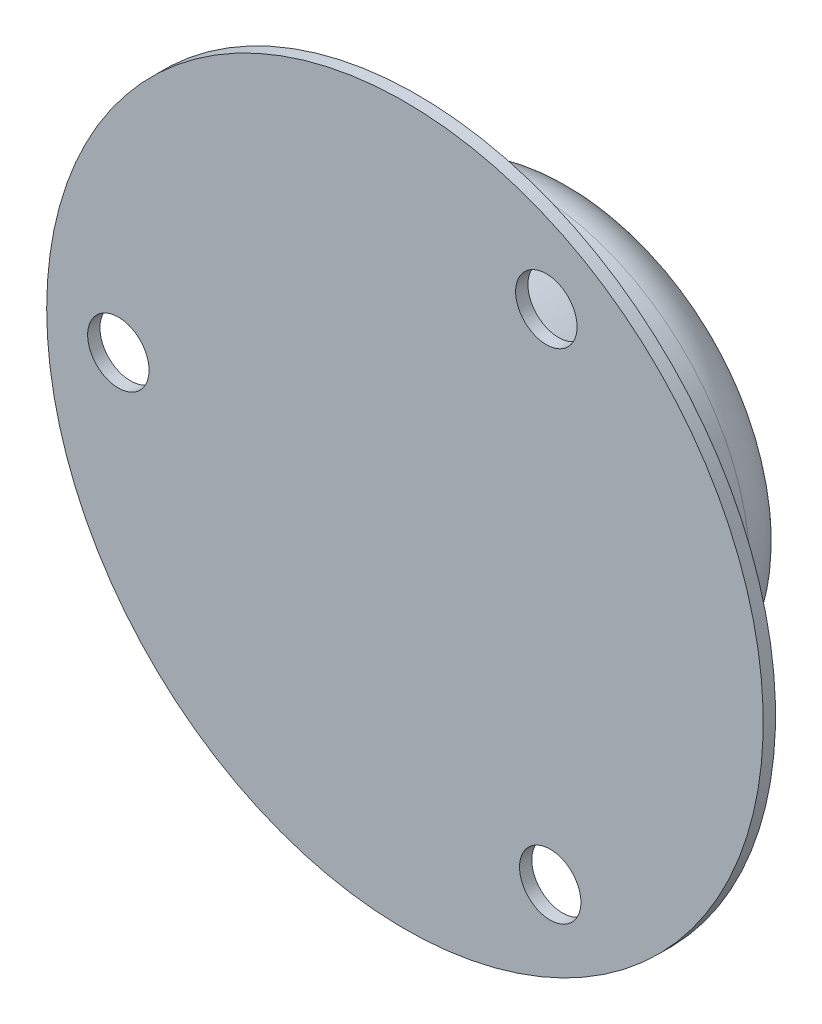
ISO-10303-21;
HEADER;
FILE_DESCRIPTION(('STEP AP214'),'2;1');
FILE_NAME('part.step','',(''),(''),'','','');
FILE_SCHEMA(('AUTOMOTIVE_DESIGN { 1 0 10303 214 1 1 1 1 }'));
ENDSEC;
DATA;
#1=APPLICATION_CONTEXT('core data for automotive mechanical design processes');
#2=APPLICATION_PROTOCOL_DEFINITION('international standard','automotive_design',2000,#1);
#3=PRODUCT_CONTEXT('',#1,'mechanical');
#4=PRODUCT('Part','Part','',(#3));
#5=PRODUCT_RELATED_PRODUCT_CATEGORY('part','',(#4));
#6=PRODUCT_DEFINITION_FORMATION('','',#4);
#7=PRODUCT_DEFINITION_CONTEXT('part definition',#1,'design');
#8=PRODUCT_DEFINITION('design','',#6,#7);
#9=PRODUCT_DEFINITION_SHAPE('','',#8);
#10=(LENGTH_UNIT() NAMED_UNIT(*) SI_UNIT(.MILLI.,.METRE.));
#11=(NAMED_UNIT(*) PLANE_ANGLE_UNIT() SI_UNIT($,.RADIAN.));
#12=(NAMED_UNIT(*) SI_UNIT($,.STERADIAN.) SOLID_ANGLE_UNIT());
#13=UNCERTAINTY_MEASURE_WITH_UNIT(LENGTH_MEASURE(1.E-05),#10,'distance_accuracy_value','');
#14=(GEOMETRIC_REPRESENTATION_CONTEXT(3) GLOBAL_UNCERTAINTY_ASSIGNED_CONTEXT((#13)) GLOBAL_UNIT_ASSIGNED_CONTEXT((#10,
#11,#12)) REPRESENTATION_CONTEXT('',''));
#15=CARTESIAN_POINT('',(0.,0.,0.));
#16=DIRECTION('',(0.,0.,1.));
#17=DIRECTION('',(1.,0.,0.));
#18=AXIS2_PLACEMENT_3D('',#15,#16,#17);
#19=CARTESIAN_POINT('',(15.3670965905298,0.,-17.2));
#20=DIRECTION('',(1.,0.,0.));
#21=DIRECTION('',(0.,1.,0.));
#22=AXIS2_PLACEMENT_3D('',#19,#20,#21);
#23=SPHERICAL_SURFACE('',#22,7.);
#24=CARTESIAN_POINT('',(15.3670965905298,0.,-17.2));
#25=DIRECTION('',(0.,0.,-1.));
#26=DIRECTION('',(1.,0.,0.));
#27=AXIS2_PLACEMENT_3D('',#24,#25,#26);
#28=CIRCLE('',#27,7.);
#29=CARTESIAN_POINT('',(8.3670965905298,0.,-17.2));
#30=VERTEX_POINT('',#29);
#31=CARTESIAN_POINT('',(22.3670965905298,0.,-17.2));
#32=VERTEX_POINT('',#31);
#33=EDGE_CURVE('E31',#30,#32,#28,.F.);
#34=ORIENTED_EDGE('',*,*,#33,.F.);
#35=CARTESIAN_POINT('',(15.3670965905298,0.,-17.2));
#36=DIRECTION('',(0.,0.,1.));
#37=DIRECTION('',(1.,0.,0.));
#38=AXIS2_PLACEMENT_3D('',#35,#36,#37);
#39=CIRCLE('',#38,7.);
#40=EDGE_CURVE('E43',#32,#30,#39,.T.);
#41=ORIENTED_EDGE('',*,*,#40,.F.);
#42=EDGE_LOOP('',(#34,#41));
#43=FACE_BOUND('',#42,.T.);
#44=ADVANCED_FACE('F27',(#43),#23,.F.);
#45=CARTESIAN_POINT('',(8.3670965905298,0.,-17.2));
#46=DIRECTION('',(0.,0.,-1.));
#47=DIRECTION('',(-1.,0.,0.));
#48=AXIS2_PLACEMENT_3D('',#45,#46,#47);
#49=PLANE('',#48);
#50=ORIENTED_EDGE('',*,*,#40,.T.);
#51=ORIENTED_EDGE('',*,*,#33,.T.);
#52=EDGE_LOOP('',(#50,#51));
#53=FACE_BOUND('',#52,.T.);
#54=CARTESIAN_POINT('',(15.3670965905298,0.,-17.2));
#55=DIRECTION('',(0.,0.,1.));
#56=DIRECTION('',(1.,0.,0.));
#57=AXIS2_PLACEMENT_3D('',#54,#55,#56);
#58=CIRCLE('',#57,8.25);
#59=CARTESIAN_POINT('',(23.6170965905298,0.,-17.2));
#60=VERTEX_POINT('',#59);
#61=EDGE_CURVE('E48',#60,#60,#58,.T.);
#62=ORIENTED_EDGE('',*,*,#61,.F.);
#63=EDGE_LOOP('',(#62));
#64=FACE_BOUND('',#63,.T.);
#65=ADVANCED_FACE('F46',(#53,#64),#49,.T.);
#66=CARTESIAN_POINT('',(15.3670965905298,0.,-14.7));
#67=DIRECTION('',(0.,0.,-1.));
#68=DIRECTION('',(-1.,0.,0.));
#69=AXIS2_PLACEMENT_3D('',#66,#67,#68);
#70=TOROIDAL_SURFACE('',#69,8.25,2.5);
#71=CARTESIAN_POINT('',(15.3670965905298,0.,-14.7));
#72=DIRECTION('',(0.,0.,-1.));
#73=DIRECTION('',(-1.,0.,0.));
#74=AXIS2_PLACEMENT_3D('',#71,#72,#73);
#75=CIRCLE('',#74,10.75);
#76=CARTESIAN_POINT('',(4.61709659052979,0.,-14.7));
#77=VERTEX_POINT('',#76);
#78=EDGE_CURVE('E50',#77,#77,#75,.F.);
#79=ORIENTED_EDGE('',*,*,#78,.F.);
#80=EDGE_LOOP('',(#79));
#81=FACE_BOUND('',#80,.T.);
#82=ORIENTED_EDGE('',*,*,#61,.T.);
#83=EDGE_LOOP('',(#82));
#84=FACE_BOUND('',#83,.T.);
#85=ADVANCED_FACE('F81',(#81,#84),#70,.T.);
#86=CARTESIAN_POINT('',(15.3670965905298,0.,-9.19999999999999));
#87=DIRECTION('',(0.,0.,-1.));
#88=DIRECTION('',(-1.,0.,0.));
#89=AXIS2_PLACEMENT_3D('',#86,#87,#88);
#90=CYLINDRICAL_SURFACE('',#89,10.75);
#91=CARTESIAN_POINT('',(15.3670965905298,0.,-9.19999999999999));
#92=DIRECTION('',(0.,0.,-1.));
#93=DIRECTION('',(-1.,0.,0.));
#94=AXIS2_PLACEMENT_3D('',#91,#92,#93);
#95=CIRCLE('',#94,10.75);
#96=CARTESIAN_POINT('',(4.61709659052979,0.,-9.19999999999999));
#97=VERTEX_POINT('',#96);
#98=EDGE_CURVE('E52',#97,#97,#95,.T.);
#99=CARTESIAN_POINT('',(4.61709659052979,0.,-9.19999999999999));
#100=CARTESIAN_POINT('',(4.61709659052979,0.,-9.25729166666666));
#101=CARTESIAN_POINT('',(4.61709659052979,0.,-9.31458333333332));
#102=CARTESIAN_POINT('',(4.61709659052979,0.,-9.42916666666666));
#103=CARTESIAN_POINT('',(4.61709659052979,0.,-9.48645833333332));
#104=CARTESIAN_POINT('',(4.61709659052979,0.,-9.60104166666666));
#105=CARTESIAN_POINT('',(4.61709659052979,0.,-9.65833333333332));
#106=CARTESIAN_POINT('',(4.61709659052979,0.,-9.77291666666666));
#107=CARTESIAN_POINT('',(4.61709659052979,0.,-9.83020833333332));
#108=CARTESIAN_POINT('',(4.61709659052979,0.,-9.94479166666666));
#109=CARTESIAN_POINT('',(4.61709659052979,0.,-10.0020833333333));
#110=CARTESIAN_POINT('',(4.61709659052979,0.,-10.1166666666667));
#111=CARTESIAN_POINT('',(4.61709659052979,0.,-10.1739583333333));
#112=CARTESIAN_POINT('',(4.61709659052979,0.,-10.2885416666667));
#113=CARTESIAN_POINT('',(4.61709659052979,0.,-10.3458333333333));
#114=CARTESIAN_POINT('',(4.61709659052979,0.,-10.4604166666667));
#115=CARTESIAN_POINT('',(4.61709659052979,0.,-10.5177083333333));
#116=CARTESIAN_POINT('',(4.61709659052979,0.,-10.6322916666667));
#117=CARTESIAN_POINT('',(4.61709659052979,0.,-10.6895833333333));
#118=CARTESIAN_POINT('',(4.61709659052979,0.,-10.8041666666667));
#119=CARTESIAN_POINT('',(4.61709659052979,0.,-10.8614583333333));
#120=CARTESIAN_POINT('',(4.61709659052979,0.,-10.9760416666667));
#121=CARTESIAN_POINT('',(4.61709659052979,0.,-11.0333333333333));
#122=CARTESIAN_POINT('',(4.61709659052979,0.,-11.1479166666667));
#123=CARTESIAN_POINT('',(4.61709659052979,0.,-11.2052083333333));
#124=CARTESIAN_POINT('',(4.61709659052979,0.,-11.3197916666667));
#125=CARTESIAN_POINT('',(4.61709659052979,0.,-11.3770833333333));
#126=CARTESIAN_POINT('',(4.61709659052979,0.,-11.4916666666667));
#127=CARTESIAN_POINT('',(4.61709659052979,0.,-11.5489583333333));
#128=CARTESIAN_POINT('',(4.61709659052979,0.,-11.6635416666667));
#129=CARTESIAN_POINT('',(4.61709659052979,0.,-11.7208333333333));
#130=CARTESIAN_POINT('',(4.61709659052979,0.,-11.8354166666667));
#131=CARTESIAN_POINT('',(4.61709659052979,0.,-11.8927083333333));
#132=CARTESIAN_POINT('',(4.61709659052979,0.,-12.0072916666667));
#133=CARTESIAN_POINT('',(4.61709659052979,0.,-12.0645833333333));
#134=CARTESIAN_POINT('',(4.61709659052979,0.,-12.1791666666667));
#135=CARTESIAN_POINT('',(4.61709659052979,0.,-12.2364583333333));
#136=CARTESIAN_POINT('',(4.61709659052979,0.,-12.3510416666667));
#137=CARTESIAN_POINT('',(4.61709659052979,0.,-12.4083333333333));
#138=CARTESIAN_POINT('',(4.61709659052979,0.,-12.5229166666667));
#139=CARTESIAN_POINT('',(4.61709659052979,0.,-12.5802083333333));
#140=CARTESIAN_POINT('',(4.61709659052979,0.,-12.6947916666667));
#141=CARTESIAN_POINT('',(4.61709659052979,0.,-12.7520833333333));
#142=CARTESIAN_POINT('',(4.61709659052979,0.,-12.8666666666667));
#143=CARTESIAN_POINT('',(4.61709659052979,0.,-12.9239583333333));
#144=CARTESIAN_POINT('',(4.61709659052979,0.,-13.0385416666667));
#145=CARTESIAN_POINT('',(4.61709659052979,0.,-13.0958333333333));
#146=CARTESIAN_POINT('',(4.61709659052979,0.,-13.2104166666667));
#147=CARTESIAN_POINT('',(4.61709659052979,0.,-13.2677083333333));
#148=CARTESIAN_POINT('',(4.61709659052979,0.,-13.3822916666667));
#149=CARTESIAN_POINT('',(4.61709659052979,0.,-13.4395833333333));
#150=CARTESIAN_POINT('',(4.61709659052979,0.,-13.5541666666667));
#151=CARTESIAN_POINT('',(4.61709659052979,0.,-13.6114583333333));
#152=CARTESIAN_POINT('',(4.61709659052979,0.,-13.7260416666667));
#153=CARTESIAN_POINT('',(4.61709659052979,0.,-13.7833333333333));
#154=CARTESIAN_POINT('',(4.61709659052979,0.,-13.8979166666667));
#155=CARTESIAN_POINT('',(4.61709659052979,0.,-13.9552083333333));
#156=CARTESIAN_POINT('',(4.61709659052979,0.,-14.0697916666667));
#157=CARTESIAN_POINT('',(4.61709659052979,0.,-14.1270833333333));
#158=CARTESIAN_POINT('',(4.61709659052979,0.,-14.2416666666667));
#159=CARTESIAN_POINT('',(4.61709659052979,0.,-14.2989583333333));
#160=CARTESIAN_POINT('',(4.61709659052979,0.,-14.4135416666667));
#161=CARTESIAN_POINT('',(4.61709659052979,0.,-14.4708333333333));
#162=CARTESIAN_POINT('',(4.61709659052979,0.,-14.5854166666667));
#163=CARTESIAN_POINT('',(4.61709659052979,0.,-14.6427083333333));
#164=CARTESIAN_POINT('',(4.61709659052979,0.,-14.7));
#165=B_SPLINE_CURVE_WITH_KNOTS('',3,(#99,#100,#101,#102,#103,#104,#105,#106,#107,#108,#109,#110,
#111,#112,#113,#114,#115,#116,#117,#118,#119,#120,#121,#122,#123,#124,#125,#126,#127,#128,#129,
#130,#131,#132,#133,#134,#135,#136,#137,#138,#139,#140,#141,#142,#143,#144,#145,#146,#147,#148,
#149,#150,#151,#152,#153,#154,#155,#156,#157,#158,#159,#160,#161,#162,#163,#164),.UNSPECIFIED.,
.F.,.F.,(4,2,2,2,2,2,2,2,2,2,2,2,2,2,2,2,2,2,2,2,2,2,2,2,2,2,2,2,2,2,2,2,4),(0.,0.171875,
0.34375,0.515625,0.687500000000001,0.859375000000001,1.03125,1.203125,1.375,1.546875,1.71875,
1.890625,2.0625,2.234375,2.40625,2.578125,2.75,2.921875,3.09375,3.265625,3.4375,3.609375,
3.78125,3.953125,4.125,4.296875,4.46875,4.640625,4.8125,4.984375,5.15625,5.328125,5.5),.UNSPECIFIED.);
#166=EDGE_CURVE('BSEAM91',#97,#77,#165,.T.);
#167=ORIENTED_EDGE('',*,*,#98,.T.);
#168=ORIENTED_EDGE('',*,*,#78,.T.);
#169=ORIENTED_EDGE('',*,*,#166,.T.);
#170=ORIENTED_EDGE('',*,*,#166,.F.);
#171=EDGE_LOOP('',(#167,#169,#168,#170));
#172=FACE_BOUND('',#171,.T.);
#173=ADVANCED_FACE('F91',(#172),#90,.T.);
#174=CARTESIAN_POINT('',(15.3670965905298,0.,-9.19999999999999));
#175=DIRECTION('',(0.,0.,1.));
#176=DIRECTION('',(1.,0.,0.));
#177=AXIS2_PLACEMENT_3D('',#174,#175,#176);
#178=PLANE('',#177);
#179=ORIENTED_EDGE('',*,*,#98,.F.);
#180=EDGE_LOOP('',(#179));
#181=FACE_BOUND('',#180,.T.);
#182=CARTESIAN_POINT('',(1.36752259540588,-0.109215177747771,-9.19999999999999));
#183=DIRECTION('',(0.,0.,1.));
#184=DIRECTION('',(1.,0.,0.));
#185=AXIS2_PLACEMENT_3D('',#182,#183,#184);
#186=CIRCLE('',#185,1.5);
#187=CARTESIAN_POINT('',(2.86752259540588,-0.109215177747771,-9.19999999999999));
#188=VERTEX_POINT('',#187);
#189=EDGE_CURVE('E64',#188,#188,#186,.T.);
#190=ORIENTED_EDGE('',*,*,#189,.T.);
#191=EDGE_LOOP('',(#190));
#192=FACE_BOUND('',#191,.T.);
#193=CARTESIAN_POINT('',(22.4614667065002,-12.0693791330634,-9.19999999999999));
#194=DIRECTION('',(0.,0.,1.));
#195=DIRECTION('',(1.,0.,0.));
#196=AXIS2_PLACEMENT_3D('',#193,#194,#195);
#197=CIRCLE('',#196,1.5);
#198=CARTESIAN_POINT('',(23.9614667065002,-12.0693791330634,-9.19999999999999));
#199=VERTEX_POINT('',#198);
#200=EDGE_CURVE('E61',#199,#199,#197,.T.);
#201=ORIENTED_EDGE('',*,*,#200,.T.);
#202=EDGE_LOOP('',(#201));
#203=FACE_BOUND('',#202,.T.);
#204=CARTESIAN_POINT('',(22.2723004696834,12.1785943108112,-9.19999999999999));
#205=DIRECTION('',(0.,0.,1.));
#206=DIRECTION('',(1.,0.,0.));
#207=AXIS2_PLACEMENT_3D('',#204,#205,#206);
#208=CIRCLE('',#207,1.5);
#209=CARTESIAN_POINT('',(23.7723004696834,12.1785943108112,-9.19999999999999));
#210=VERTEX_POINT('',#209);
#211=EDGE_CURVE('E58',#210,#210,#208,.T.);
#212=ORIENTED_EDGE('',*,*,#211,.T.);
#213=EDGE_LOOP('',(#212));
#214=FACE_BOUND('',#213,.T.);
#215=CARTESIAN_POINT('',(15.3670965905298,0.,-9.19999999999999));
#216=DIRECTION('',(0.,0.,-1.));
#217=DIRECTION('',(-1.,0.,0.));
#218=AXIS2_PLACEMENT_3D('',#215,#216,#217);
#219=CIRCLE('',#218,17.5);
#220=CARTESIAN_POINT('',(-2.13290340947021,0.,-9.19999999999999));
#221=VERTEX_POINT('',#220);
#222=EDGE_CURVE('E55',#221,#221,#219,.F.);
#223=ORIENTED_EDGE('',*,*,#222,.F.);
#224=EDGE_LOOP('',(#223));
#225=FACE_BOUND('',#224,.T.);
#226=ADVANCED_FACE('F134',(#181,#192,#203,#214,#225),#178,.F.);
#227=CARTESIAN_POINT('',(15.3670965905298,0.,-8.59999999999999));
#228=DIRECTION('',(0.,0.,-1.));
#229=DIRECTION('',(-1.,0.,0.));
#230=AXIS2_PLACEMENT_3D('',#227,#228,#229);
#231=CYLINDRICAL_SURFACE('',#230,17.5);
#232=CARTESIAN_POINT('',(15.3670965905298,0.,-8.59999999999999));
#233=DIRECTION('',(0.,0.,-1.));
#234=DIRECTION('',(-1.,0.,0.));
#235=AXIS2_PLACEMENT_3D('',#232,#233,#234);
#236=CIRCLE('',#235,17.5);
#237=CARTESIAN_POINT('',(-2.13290340947021,0.,-8.59999999999999));
#238=VERTEX_POINT('',#237);
#239=EDGE_CURVE('E67',#238,#238,#236,.F.);
#240=CARTESIAN_POINT('',(-2.13290340947021,0.,-8.59999999999999));
#241=CARTESIAN_POINT('',(-2.13290340947021,0.,-8.60624999999999));
#242=CARTESIAN_POINT('',(-2.13290340947021,0.,-8.61249999999999));
#243=CARTESIAN_POINT('',(-2.13290340947021,0.,-8.62499999999999));
#244=CARTESIAN_POINT('',(-2.13290340947021,0.,-8.63124999999999));
#245=CARTESIAN_POINT('',(-2.13290340947021,0.,-8.64374999999999));
#246=CARTESIAN_POINT('',(-2.13290340947021,0.,-8.64999999999999));
#247=CARTESIAN_POINT('',(-2.13290340947021,0.,-8.66249999999999));
#248=CARTESIAN_POINT('',(-2.13290340947021,0.,-8.66874999999999));
#249=CARTESIAN_POINT('',(-2.13290340947021,0.,-8.68124999999999));
#250=CARTESIAN_POINT('',(-2.13290340947021,0.,-8.68749999999999));
#251=CARTESIAN_POINT('',(-2.13290340947021,0.,-8.69999999999999));
#252=CARTESIAN_POINT('',(-2.13290340947021,0.,-8.70624999999999));
#253=CARTESIAN_POINT('',(-2.13290340947021,0.,-8.71874999999999));
#254=CARTESIAN_POINT('',(-2.13290340947021,0.,-8.72499999999999));
#255=CARTESIAN_POINT('',(-2.13290340947021,0.,-8.73749999999999));
#256=CARTESIAN_POINT('',(-2.13290340947021,0.,-8.74374999999999));
#257=CARTESIAN_POINT('',(-2.13290340947021,0.,-8.75624999999999));
#258=CARTESIAN_POINT('',(-2.13290340947021,0.,-8.76249999999999));
#259=CARTESIAN_POINT('',(-2.13290340947021,0.,-8.77499999999999));
#260=CARTESIAN_POINT('',(-2.13290340947021,0.,-8.78124999999999));
#261=CARTESIAN_POINT('',(-2.13290340947021,0.,-8.79374999999999));
#262=CARTESIAN_POINT('',(-2.13290340947021,0.,-8.79999999999999));
#263=CARTESIAN_POINT('',(-2.13290340947021,0.,-8.81249999999999));
#264=CARTESIAN_POINT('',(-2.13290340947021,0.,-8.81874999999999));
#265=CARTESIAN_POINT('',(-2.13290340947021,0.,-8.83124999999999));
#266=CARTESIAN_POINT('',(-2.13290340947021,0.,-8.83749999999999));
#267=CARTESIAN_POINT('',(-2.13290340947021,0.,-8.84999999999999));
#268=CARTESIAN_POINT('',(-2.13290340947021,0.,-8.85624999999999));
#269=CARTESIAN_POINT('',(-2.13290340947021,0.,-8.86874999999999));
#270=CARTESIAN_POINT('',(-2.13290340947021,0.,-8.87499999999999));
#271=CARTESIAN_POINT('',(-2.13290340947021,0.,-8.88749999999999));
#272=CARTESIAN_POINT('',(-2.13290340947021,0.,-8.89374999999999));
#273=CARTESIAN_POINT('',(-2.13290340947021,0.,-8.90624999999999));
#274=CARTESIAN_POINT('',(-2.13290340947021,0.,-8.91249999999999));
#275=CARTESIAN_POINT('',(-2.13290340947021,0.,-8.92499999999999));
#276=CARTESIAN_POINT('',(-2.13290340947021,0.,-8.93124999999999));
#277=CARTESIAN_POINT('',(-2.13290340947021,0.,-8.94374999999999));
#278=CARTESIAN_POINT('',(-2.13290340947021,0.,-8.94999999999999));
#279=CARTESIAN_POINT('',(-2.13290340947021,0.,-8.96249999999999));
#280=CARTESIAN_POINT('',(-2.13290340947021,0.,-8.96874999999999));
#281=CARTESIAN_POINT('',(-2.13290340947021,0.,-8.98124999999999));
#282=CARTESIAN_POINT('',(-2.13290340947021,0.,-8.98749999999999));
#283=CARTESIAN_POINT('',(-2.13290340947021,0.,-8.99999999999999));
#284=CARTESIAN_POINT('',(-2.13290340947021,0.,-9.00624999999999));
#285=CARTESIAN_POINT('',(-2.13290340947021,0.,-9.01874999999999));
#286=CARTESIAN_POINT('',(-2.13290340947021,0.,-9.02499999999999));
#287=CARTESIAN_POINT('',(-2.13290340947021,0.,-9.03749999999999));
#288=CARTESIAN_POINT('',(-2.13290340947021,0.,-9.04374999999999));
#289=CARTESIAN_POINT('',(-2.13290340947021,0.,-9.05624999999999));
#290=CARTESIAN_POINT('',(-2.13290340947021,0.,-9.06249999999999));
#291=CARTESIAN_POINT('',(-2.13290340947021,0.,-9.07499999999999));
#292=CARTESIAN_POINT('',(-2.13290340947021,0.,-9.08124999999999));
#293=CARTESIAN_POINT('',(-2.13290340947021,0.,-9.09374999999999));
#294=CARTESIAN_POINT('',(-2.13290340947021,0.,-9.09999999999999));
#295=CARTESIAN_POINT('',(-2.13290340947021,0.,-9.11249999999999));
#296=CARTESIAN_POINT('',(-2.13290340947021,0.,-9.11874999999999));
#297=CARTESIAN_POINT('',(-2.13290340947021,0.,-9.13124999999999));
#298=CARTESIAN_POINT('',(-2.13290340947021,0.,-9.13749999999999));
#299=CARTESIAN_POINT('',(-2.13290340947021,0.,-9.14999999999999));
#300=CARTESIAN_POINT('',(-2.13290340947021,0.,-9.15624999999999));
#301=CARTESIAN_POINT('',(-2.13290340947021,0.,-9.16874999999999));
#302=CARTESIAN_POINT('',(-2.13290340947021,0.,-9.17499999999999));
#303=CARTESIAN_POINT('',(-2.13290340947021,0.,-9.18749999999999));
#304=CARTESIAN_POINT('',(-2.13290340947021,0.,-9.19374999999999));
#305=CARTESIAN_POINT('',(-2.13290340947021,0.,-9.19999999999999));
#306=B_SPLINE_CURVE_WITH_KNOTS('',3,(#240,#241,#242,#243,#244,#245,#246,#247,#248,#249,#250,
#251,#252,#253,#254,#255,#256,#257,#258,#259,#260,#261,#262,#263,#264,#265,#266,#267,#268,#269,
#270,#271,#272,#273,#274,#275,#276,#277,#278,#279,#280,#281,#282,#283,#284,#285,#286,#287,#288,
#289,#290,#291,#292,#293,#294,#295,#296,#297,#298,#299,#300,#301,#302,#303,#304,#305),
.UNSPECIFIED.,.F.,.F.,(4,2,2,2,2,2,2,2,2,2,2,2,2,2,2,2,2,2,2,2,2,2,2,2,2,2,2,2,2,2,2,2,4),(0.,
0.0187500000000014,0.0375000000000011,0.0562500000000007,0.0750000000000004,0.0937500000000001,
0.112500000000001,0.131250000000001,0.150000000000001,0.168750000000001,0.1875,
0.206250000000002,0.225000000000001,0.243750000000001,0.262500000000001,0.28125,0.3,
0.318750000000001,0.337500000000001,0.356250000000001,0.375,0.39375,0.412500000000001,
0.431250000000001,0.450000000000001,0.46875,0.4875,0.506250000000002,0.525000000000001,
0.543750000000001,0.5625,0.58125,0.600000000000002),.UNSPECIFIED.);
#307=EDGE_CURVE('BSEAM131',#238,#221,#306,.T.);
#308=ORIENTED_EDGE('',*,*,#239,.F.);
#309=ORIENTED_EDGE('',*,*,#222,.T.);
#310=ORIENTED_EDGE('',*,*,#307,.T.);
#311=ORIENTED_EDGE('',*,*,#307,.F.);
#312=EDGE_LOOP('',(#308,#310,#309,#311));
#313=FACE_BOUND('',#312,.T.);
#314=ADVANCED_FACE('F131',(#313),#231,.T.);
#315=CARTESIAN_POINT('',(22.2723004696834,12.1785943108112,-9.19999999999999));
#316=DIRECTION('',(0.,0.,1.));
#317=DIRECTION('',(1.,0.,0.));
#318=AXIS2_PLACEMENT_3D('',#315,#316,#317);
#319=CYLINDRICAL_SURFACE('',#318,1.5);
#320=CARTESIAN_POINT('',(22.2723004696834,12.1785943108112,-8.59999999999999));
#321=DIRECTION('',(0.,0.,1.));
#322=DIRECTION('',(1.,0.,0.));
#323=AXIS2_PLACEMENT_3D('',#320,#321,#322);
#324=CIRCLE('',#323,1.5);
#325=CARTESIAN_POINT('',(23.7723004696834,12.1785943108112,-8.59999999999999));
#326=VERTEX_POINT('',#325);
#327=EDGE_CURVE('E70',#326,#326,#324,.F.);
#328=CARTESIAN_POINT('',(23.7723004696834,12.1785943108112,-8.59999999999999));
#329=CARTESIAN_POINT('',(23.7723004696834,12.1785943108112,-8.60624999999999));
#330=CARTESIAN_POINT('',(23.7723004696834,12.1785943108112,-8.61249999999999));
#331=CARTESIAN_POINT('',(23.7723004696834,12.1785943108112,-8.62499999999999));
#332=CARTESIAN_POINT('',(23.7723004696834,12.1785943108112,-8.63124999999999));
#333=CARTESIAN_POINT('',(23.7723004696834,12.1785943108112,-8.64374999999999));
#334=CARTESIAN_POINT('',(23.7723004696834,12.1785943108112,-8.65));
#335=CARTESIAN_POINT('',(23.7723004696834,12.1785943108112,-8.66249999999999));
#336=CARTESIAN_POINT('',(23.7723004696834,12.1785943108112,-8.66874999999999));
#337=CARTESIAN_POINT('',(23.7723004696834,12.1785943108112,-8.68124999999999));
#338=CARTESIAN_POINT('',(23.7723004696834,12.1785943108112,-8.68749999999999));
#339=CARTESIAN_POINT('',(23.7723004696834,12.1785943108112,-8.69999999999999));
#340=CARTESIAN_POINT('',(23.7723004696834,12.1785943108112,-8.70624999999999));
#341=CARTESIAN_POINT('',(23.7723004696834,12.1785943108112,-8.71874999999999));
#342=CARTESIAN_POINT('',(23.7723004696834,12.1785943108112,-8.72499999999999));
#343=CARTESIAN_POINT('',(23.7723004696834,12.1785943108112,-8.73749999999999));
#344=CARTESIAN_POINT('',(23.7723004696834,12.1785943108112,-8.74375));
#345=CARTESIAN_POINT('',(23.7723004696834,12.1785943108112,-8.75624999999999));
#346=CARTESIAN_POINT('',(23.7723004696834,12.1785943108112,-8.76249999999999));
#347=CARTESIAN_POINT('',(23.7723004696834,12.1785943108112,-8.77499999999999));
#348=CARTESIAN_POINT('',(23.7723004696834,12.1785943108112,-8.78124999999999));
#349=CARTESIAN_POINT('',(23.7723004696834,12.1785943108112,-8.79374999999999));
#350=CARTESIAN_POINT('',(23.7723004696834,12.1785943108112,-8.79999999999999));
#351=CARTESIAN_POINT('',(23.7723004696834,12.1785943108112,-8.81249999999999));
#352=CARTESIAN_POINT('',(23.7723004696834,12.1785943108112,-8.81874999999999));
#353=CARTESIAN_POINT('',(23.7723004696834,12.1785943108112,-8.83124999999999));
#354=CARTESIAN_POINT('',(23.7723004696834,12.1785943108112,-8.8375));
#355=CARTESIAN_POINT('',(23.7723004696834,12.1785943108112,-8.84999999999999));
#356=CARTESIAN_POINT('',(23.7723004696834,12.1785943108112,-8.85624999999999));
#357=CARTESIAN_POINT('',(23.7723004696834,12.1785943108112,-8.86874999999999));
#358=CARTESIAN_POINT('',(23.7723004696834,12.1785943108112,-8.87499999999999));
#359=CARTESIAN_POINT('',(23.7723004696834,12.1785943108112,-8.88749999999999));
#360=CARTESIAN_POINT('',(23.7723004696834,12.1785943108112,-8.89374999999999));
#361=CARTESIAN_POINT('',(23.7723004696834,12.1785943108112,-8.90624999999999));
#362=CARTESIAN_POINT('',(23.7723004696834,12.1785943108112,-8.91249999999999));
#363=CARTESIAN_POINT('',(23.7723004696834,12.1785943108112,-8.92499999999999));
#364=CARTESIAN_POINT('',(23.7723004696834,12.1785943108112,-8.93125));
#365=CARTESIAN_POINT('',(23.7723004696834,12.1785943108112,-8.94374999999999));
#366=CARTESIAN_POINT('',(23.7723004696834,12.1785943108112,-8.94999999999999));
#367=CARTESIAN_POINT('',(23.7723004696834,12.1785943108112,-8.96249999999999));
#368=CARTESIAN_POINT('',(23.7723004696834,12.1785943108112,-8.96874999999999));
#369=CARTESIAN_POINT('',(23.7723004696834,12.1785943108112,-8.98124999999999));
#370=CARTESIAN_POINT('',(23.7723004696834,12.1785943108112,-8.98749999999999));
#371=CARTESIAN_POINT('',(23.7723004696834,12.1785943108112,-8.99999999999999));
#372=CARTESIAN_POINT('',(23.7723004696834,12.1785943108112,-9.00624999999999));
#373=CARTESIAN_POINT('',(23.7723004696834,12.1785943108112,-9.01874999999999));
#374=CARTESIAN_POINT('',(23.7723004696834,12.1785943108112,-9.025));
#375=CARTESIAN_POINT('',(23.7723004696834,12.1785943108112,-9.03749999999999));
#376=CARTESIAN_POINT('',(23.7723004696834,12.1785943108112,-9.04374999999999));
#377=CARTESIAN_POINT('',(23.7723004696834,12.1785943108112,-9.05624999999999));
#378=CARTESIAN_POINT('',(23.7723004696834,12.1785943108112,-9.06249999999999));
#379=CARTESIAN_POINT('',(23.7723004696834,12.1785943108112,-9.07499999999999));
#380=CARTESIAN_POINT('',(23.7723004696834,12.1785943108112,-9.08124999999999));
#381=CARTESIAN_POINT('',(23.7723004696834,12.1785943108112,-9.09374999999999));
#382=CARTESIAN_POINT('',(23.7723004696834,12.1785943108112,-9.09999999999999));
#383=CARTESIAN_POINT('',(23.7723004696834,12.1785943108112,-9.11249999999999));
#384=CARTESIAN_POINT('',(23.7723004696834,12.1785943108112,-9.11875));
#385=CARTESIAN_POINT('',(23.7723004696834,12.1785943108112,-9.13124999999999));
#386=CARTESIAN_POINT('',(23.7723004696834,12.1785943108112,-9.13749999999999));
#387=CARTESIAN_POINT('',(23.7723004696834,12.1785943108112,-9.14999999999999));
#388=CARTESIAN_POINT('',(23.7723004696834,12.1785943108112,-9.15624999999999));
#389=CARTESIAN_POINT('',(23.7723004696834,12.1785943108112,-9.16874999999999));
#390=CARTESIAN_POINT('',(23.7723004696834,12.1785943108112,-9.17499999999999));
#391=CARTESIAN_POINT('',(23.7723004696834,12.1785943108112,-9.18749999999999));
#392=CARTESIAN_POINT('',(23.7723004696834,12.1785943108112,-9.19374999999999));
#393=CARTESIAN_POINT('',(23.7723004696834,12.1785943108112,-9.19999999999999));
#394=B_SPLINE_CURVE_WITH_KNOTS('',3,(#328,#329,#330,#331,#332,#333,#334,#335,#336,#337,#338,
#339,#340,#341,#342,#343,#344,#345,#346,#347,#348,#349,#350,#351,#352,#353,#354,#355,#356,#357,
#358,#359,#360,#361,#362,#363,#364,#365,#366,#367,#368,#369,#370,#371,#372,#373,#374,#375,#376,
#377,#378,#379,#380,#381,#382,#383,#384,#385,#386,#387,#388,#389,#390,#391,#392,#393),
.UNSPECIFIED.,.F.,.F.,(4,2,2,2,2,2,2,2,2,2,2,2,2,2,2,2,2,2,2,2,2,2,2,2,2,2,2,2,2,2,2,2,4),(0.,
0.0187500000000014,0.0375000000000011,0.0562500000000007,0.0750000000000004,0.0937500000000001,
0.112500000000001,0.131250000000001,0.150000000000001,0.168750000000001,0.1875,
0.206250000000002,0.225000000000001,0.243750000000001,0.262500000000001,0.28125,
0.300000000000002,0.318750000000001,0.337500000000001,0.356250000000001,0.375,0.39375,
0.412500000000001,0.431250000000001,0.450000000000001,0.46875,0.4875,0.506250000000002,
0.525000000000001,0.543750000000001,0.5625,0.58125,0.6),.UNSPECIFIED.);
#395=EDGE_CURVE('BSEAM127',#326,#210,#394,.T.);
#396=ORIENTED_EDGE('',*,*,#327,.F.);
#397=ORIENTED_EDGE('',*,*,#211,.F.);
#398=ORIENTED_EDGE('',*,*,#395,.T.);
#399=ORIENTED_EDGE('',*,*,#395,.F.);
#400=EDGE_LOOP('',(#396,#398,#397,#399));
#401=FACE_BOUND('',#400,.T.);
#402=ADVANCED_FACE('F127',(#401),#319,.F.);
#403=CARTESIAN_POINT('',(22.4614667065002,-12.0693791330634,-9.19999999999999));
#404=DIRECTION('',(0.,0.,1.));
#405=DIRECTION('',(1.,0.,0.));
#406=AXIS2_PLACEMENT_3D('',#403,#404,#405);
#407=CYLINDRICAL_SURFACE('',#406,1.5);
#408=CARTESIAN_POINT('',(22.4614667065002,-12.0693791330634,-8.59999999999999));
#409=DIRECTION('',(0.,0.,1.));
#410=DIRECTION('',(1.,0.,0.));
#411=AXIS2_PLACEMENT_3D('',#408,#409,#410);
#412=CIRCLE('',#411,1.5);
#413=CARTESIAN_POINT('',(23.9614667065002,-12.0693791330634,-8.59999999999999));
#414=VERTEX_POINT('',#413);
#415=EDGE_CURVE('E37',#414,#414,#412,.F.);
#416=CARTESIAN_POINT('',(23.9614667065002,-12.0693791330634,-8.59999999999999));
#417=CARTESIAN_POINT('',(23.9614667065002,-12.0693791330634,-8.60624999999999));
#418=CARTESIAN_POINT('',(23.9614667065002,-12.0693791330634,-8.61249999999999));
#419=CARTESIAN_POINT('',(23.9614667065002,-12.0693791330634,-8.62499999999999));
#420=CARTESIAN_POINT('',(23.9614667065002,-12.0693791330634,-8.63124999999999));
#421=CARTESIAN_POINT('',(23.9614667065002,-12.0693791330634,-8.64374999999999));
#422=CARTESIAN_POINT('',(23.9614667065002,-12.0693791330634,-8.65));
#423=CARTESIAN_POINT('',(23.9614667065002,-12.0693791330634,-8.66249999999999));
#424=CARTESIAN_POINT('',(23.9614667065002,-12.0693791330634,-8.66874999999999));
#425=CARTESIAN_POINT('',(23.9614667065002,-12.0693791330634,-8.68124999999999));
#426=CARTESIAN_POINT('',(23.9614667065002,-12.0693791330634,-8.68749999999999));
#427=CARTESIAN_POINT('',(23.9614667065002,-12.0693791330634,-8.69999999999999));
#428=CARTESIAN_POINT('',(23.9614667065002,-12.0693791330634,-8.70624999999999));
#429=CARTESIAN_POINT('',(23.9614667065002,-12.0693791330634,-8.71874999999999));
#430=CARTESIAN_POINT('',(23.9614667065002,-12.0693791330634,-8.72499999999999));
#431=CARTESIAN_POINT('',(23.9614667065002,-12.0693791330634,-8.73749999999999));
#432=CARTESIAN_POINT('',(23.9614667065002,-12.0693791330634,-8.74375));
#433=CARTESIAN_POINT('',(23.9614667065002,-12.0693791330634,-8.75624999999999));
#434=CARTESIAN_POINT('',(23.9614667065002,-12.0693791330634,-8.76249999999999));
#435=CARTESIAN_POINT('',(23.9614667065002,-12.0693791330634,-8.77499999999999));
#436=CARTESIAN_POINT('',(23.9614667065002,-12.0693791330634,-8.78124999999999));
#437=CARTESIAN_POINT('',(23.9614667065002,-12.0693791330634,-8.79374999999999));
#438=CARTESIAN_POINT('',(23.9614667065002,-12.0693791330634,-8.79999999999999));
#439=CARTESIAN_POINT('',(23.9614667065002,-12.0693791330634,-8.81249999999999));
#440=CARTESIAN_POINT('',(23.9614667065002,-12.0693791330634,-8.81874999999999));
#441=CARTESIAN_POINT('',(23.9614667065002,-12.0693791330634,-8.83124999999999));
#442=CARTESIAN_POINT('',(23.9614667065002,-12.0693791330634,-8.8375));
#443=CARTESIAN_POINT('',(23.9614667065002,-12.0693791330634,-8.84999999999999));
#444=CARTESIAN_POINT('',(23.9614667065002,-12.0693791330634,-8.85624999999999));
#445=CARTESIAN_POINT('',(23.9614667065002,-12.0693791330634,-8.86874999999999));
#446=CARTESIAN_POINT('',(23.9614667065002,-12.0693791330634,-8.87499999999999));
#447=CARTESIAN_POINT('',(23.9614667065002,-12.0693791330634,-8.88749999999999));
#448=CARTESIAN_POINT('',(23.9614667065002,-12.0693791330634,-8.89374999999999));
#449=CARTESIAN_POINT('',(23.9614667065002,-12.0693791330634,-8.90624999999999));
#450=CARTESIAN_POINT('',(23.9614667065002,-12.0693791330634,-8.91249999999999));
#451=CARTESIAN_POINT('',(23.9614667065002,-12.0693791330634,-8.92499999999999));
#452=CARTESIAN_POINT('',(23.9614667065002,-12.0693791330634,-8.93125));
#453=CARTESIAN_POINT('',(23.9614667065002,-12.0693791330634,-8.94374999999999));
#454=CARTESIAN_POINT('',(23.9614667065002,-12.0693791330634,-8.94999999999999));
#455=CARTESIAN_POINT('',(23.9614667065002,-12.0693791330634,-8.96249999999999));
#456=CARTESIAN_POINT('',(23.9614667065002,-12.0693791330634,-8.96874999999999));
#457=CARTESIAN_POINT('',(23.9614667065002,-12.0693791330634,-8.98124999999999));
#458=CARTESIAN_POINT('',(23.9614667065002,-12.0693791330634,-8.98749999999999));
#459=CARTESIAN_POINT('',(23.9614667065002,-12.0693791330634,-8.99999999999999));
#460=CARTESIAN_POINT('',(23.9614667065002,-12.0693791330634,-9.00624999999999));
#461=CARTESIAN_POINT('',(23.9614667065002,-12.0693791330634,-9.01874999999999));
#462=CARTESIAN_POINT('',(23.9614667065002,-12.0693791330634,-9.025));
#463=CARTESIAN_POINT('',(23.9614667065002,-12.0693791330634,-9.03749999999999));
#464=CARTESIAN_POINT('',(23.9614667065002,-12.0693791330634,-9.04374999999999));
#465=CARTESIAN_POINT('',(23.9614667065002,-12.0693791330634,-9.05624999999999));
#466=CARTESIAN_POINT('',(23.9614667065002,-12.0693791330634,-9.06249999999999));
#467=CARTESIAN_POINT('',(23.9614667065002,-12.0693791330634,-9.07499999999999));
#468=CARTESIAN_POINT('',(23.9614667065002,-12.0693791330634,-9.08124999999999));
#469=CARTESIAN_POINT('',(23.9614667065002,-12.0693791330634,-9.09374999999999));
#470=CARTESIAN_POINT('',(23.9614667065002,-12.0693791330634,-9.09999999999999));
#471=CARTESIAN_POINT('',(23.9614667065002,-12.0693791330634,-9.11249999999999));
#472=CARTESIAN_POINT('',(23.9614667065002,-12.0693791330634,-9.11875));
#473=CARTESIAN_POINT('',(23.9614667065002,-12.0693791330634,-9.13124999999999));
#474=CARTESIAN_POINT('',(23.9614667065002,-12.0693791330634,-9.13749999999999));
#475=CARTESIAN_POINT('',(23.9614667065002,-12.0693791330634,-9.14999999999999));
#476=CARTESIAN_POINT('',(23.9614667065002,-12.0693791330634,-9.15624999999999));
#477=CARTESIAN_POINT('',(23.9614667065002,-12.0693791330634,-9.16874999999999));
#478=CARTESIAN_POINT('',(23.9614667065002,-12.0693791330634,-9.17499999999999));
#479=CARTESIAN_POINT('',(23.9614667065002,-12.0693791330634,-9.18749999999999));
#480=CARTESIAN_POINT('',(23.9614667065002,-12.0693791330634,-9.19374999999999));
#481=CARTESIAN_POINT('',(23.9614667065002,-12.0693791330634,-9.19999999999999));
#482=B_SPLINE_CURVE_WITH_KNOTS('',3,(#416,#417,#418,#419,#420,#421,#422,#423,#424,#425,#426,
#427,#428,#429,#430,#431,#432,#433,#434,#435,#436,#437,#438,#439,#440,#441,#442,#443,#444,#445,
#446,#447,#448,#449,#450,#451,#452,#453,#454,#455,#456,#457,#458,#459,#460,#461,#462,#463,#464,
#465,#466,#467,#468,#469,#470,#471,#472,#473,#474,#475,#476,#477,#478,#479,#480,#481),
.UNSPECIFIED.,.F.,.F.,(4,2,2,2,2,2,2,2,2,2,2,2,2,2,2,2,2,2,2,2,2,2,2,2,2,2,2,2,2,2,2,2,4),(0.,
0.0187500000000014,0.0375000000000011,0.0562500000000007,0.0750000000000004,0.0937500000000001,
0.112500000000001,0.131250000000001,0.150000000000001,0.168750000000001,0.1875,
0.206250000000002,0.225000000000001,0.243750000000001,0.262500000000001,0.28125,
0.300000000000002,0.318750000000001,0.337500000000001,0.356250000000001,0.375,0.39375,
0.412500000000001,0.431250000000001,0.450000000000001,0.46875,0.4875,0.506250000000002,
0.525000000000001,0.543750000000001,0.5625,0.58125,0.6),.UNSPECIFIED.);
#483=EDGE_CURVE('BSEAM120',#414,#199,#482,.T.);
#484=ORIENTED_EDGE('',*,*,#415,.F.);
#485=ORIENTED_EDGE('',*,*,#200,.F.);
#486=ORIENTED_EDGE('',*,*,#483,.T.);
#487=ORIENTED_EDGE('',*,*,#483,.F.);
#488=EDGE_LOOP('',(#484,#486,#485,#487));
#489=FACE_BOUND('',#488,.T.);
#490=ADVANCED_FACE('F120',(#489),#407,.F.);
#491=CARTESIAN_POINT('',(1.36752259540588,-0.109215177747771,-9.19999999999999));
#492=DIRECTION('',(0.,0.,1.));
#493=DIRECTION('',(1.,0.,0.));
#494=AXIS2_PLACEMENT_3D('',#491,#492,#493);
#495=CYLINDRICAL_SURFACE('',#494,1.5);
#496=CARTESIAN_POINT('',(1.36752259540588,-0.109215177747771,-8.59999999999999));
#497=DIRECTION('',(0.,0.,1.));
#498=DIRECTION('',(1.,0.,0.));
#499=AXIS2_PLACEMENT_3D('',#496,#497,#498);
#500=CIRCLE('',#499,1.5);
#501=CARTESIAN_POINT('',(2.86752259540588,-0.109215177747771,-8.59999999999999));
#502=VERTEX_POINT('',#501);
#503=EDGE_CURVE('E13',#502,#502,#500,.F.);
#504=CARTESIAN_POINT('',(2.86752259540588,-0.109215177747771,-8.59999999999999));
#505=CARTESIAN_POINT('',(2.86752259540588,-0.109215177747771,-8.60624999999999));
#506=CARTESIAN_POINT('',(2.86752259540588,-0.109215177747771,-8.61249999999999));
#507=CARTESIAN_POINT('',(2.86752259540588,-0.109215177747771,-8.62499999999999));
#508=CARTESIAN_POINT('',(2.86752259540588,-0.109215177747771,-8.63124999999999));
#509=CARTESIAN_POINT('',(2.86752259540588,-0.109215177747771,-8.64374999999999));
#510=CARTESIAN_POINT('',(2.86752259540588,-0.109215177747771,-8.65));
#511=CARTESIAN_POINT('',(2.86752259540588,-0.109215177747771,-8.66249999999999));
#512=CARTESIAN_POINT('',(2.86752259540588,-0.109215177747771,-8.66874999999999));
#513=CARTESIAN_POINT('',(2.86752259540588,-0.109215177747771,-8.68124999999999));
#514=CARTESIAN_POINT('',(2.86752259540588,-0.109215177747771,-8.68749999999999));
#515=CARTESIAN_POINT('',(2.86752259540588,-0.109215177747771,-8.69999999999999));
#516=CARTESIAN_POINT('',(2.86752259540588,-0.109215177747771,-8.70624999999999));
#517=CARTESIAN_POINT('',(2.86752259540588,-0.109215177747771,-8.71874999999999));
#518=CARTESIAN_POINT('',(2.86752259540588,-0.109215177747771,-8.72499999999999));
#519=CARTESIAN_POINT('',(2.86752259540588,-0.109215177747771,-8.73749999999999));
#520=CARTESIAN_POINT('',(2.86752259540588,-0.109215177747771,-8.74375));
#521=CARTESIAN_POINT('',(2.86752259540588,-0.109215177747771,-8.75624999999999));
#522=CARTESIAN_POINT('',(2.86752259540588,-0.109215177747771,-8.76249999999999));
#523=CARTESIAN_POINT('',(2.86752259540588,-0.109215177747771,-8.77499999999999));
#524=CARTESIAN_POINT('',(2.86752259540588,-0.109215177747771,-8.78124999999999));
#525=CARTESIAN_POINT('',(2.86752259540588,-0.109215177747771,-8.79374999999999));
#526=CARTESIAN_POINT('',(2.86752259540588,-0.109215177747771,-8.79999999999999));
#527=CARTESIAN_POINT('',(2.86752259540588,-0.109215177747771,-8.81249999999999));
#528=CARTESIAN_POINT('',(2.86752259540588,-0.109215177747771,-8.81874999999999));
#529=CARTESIAN_POINT('',(2.86752259540588,-0.109215177747771,-8.83124999999999));
#530=CARTESIAN_POINT('',(2.86752259540588,-0.109215177747771,-8.8375));
#531=CARTESIAN_POINT('',(2.86752259540588,-0.109215177747771,-8.84999999999999));
#532=CARTESIAN_POINT('',(2.86752259540588,-0.109215177747771,-8.85624999999999));
#533=CARTESIAN_POINT('',(2.86752259540588,-0.109215177747771,-8.86874999999999));
#534=CARTESIAN_POINT('',(2.86752259540588,-0.109215177747771,-8.87499999999999));
#535=CARTESIAN_POINT('',(2.86752259540588,-0.109215177747771,-8.88749999999999));
#536=CARTESIAN_POINT('',(2.86752259540588,-0.109215177747771,-8.89374999999999));
#537=CARTESIAN_POINT('',(2.86752259540588,-0.109215177747771,-8.90624999999999));
#538=CARTESIAN_POINT('',(2.86752259540588,-0.109215177747771,-8.91249999999999));
#539=CARTESIAN_POINT('',(2.86752259540588,-0.109215177747771,-8.92499999999999));
#540=CARTESIAN_POINT('',(2.86752259540588,-0.109215177747771,-8.93125));
#541=CARTESIAN_POINT('',(2.86752259540588,-0.109215177747771,-8.94374999999999));
#542=CARTESIAN_POINT('',(2.86752259540588,-0.109215177747771,-8.94999999999999));
#543=CARTESIAN_POINT('',(2.86752259540588,-0.109215177747771,-8.96249999999999));
#544=CARTESIAN_POINT('',(2.86752259540588,-0.109215177747771,-8.96874999999999));
#545=CARTESIAN_POINT('',(2.86752259540588,-0.109215177747771,-8.98124999999999));
#546=CARTESIAN_POINT('',(2.86752259540588,-0.109215177747771,-8.98749999999999));
#547=CARTESIAN_POINT('',(2.86752259540588,-0.109215177747771,-8.99999999999999));
#548=CARTESIAN_POINT('',(2.86752259540588,-0.109215177747771,-9.00624999999999));
#549=CARTESIAN_POINT('',(2.86752259540588,-0.109215177747771,-9.01874999999999));
#550=CARTESIAN_POINT('',(2.86752259540588,-0.109215177747771,-9.025));
#551=CARTESIAN_POINT('',(2.86752259540588,-0.109215177747771,-9.03749999999999));
#552=CARTESIAN_POINT('',(2.86752259540588,-0.109215177747771,-9.04374999999999));
#553=CARTESIAN_POINT('',(2.86752259540588,-0.109215177747771,-9.05624999999999));
#554=CARTESIAN_POINT('',(2.86752259540588,-0.109215177747771,-9.06249999999999));
#555=CARTESIAN_POINT('',(2.86752259540588,-0.109215177747771,-9.07499999999999));
#556=CARTESIAN_POINT('',(2.86752259540588,-0.109215177747771,-9.08124999999999));
#557=CARTESIAN_POINT('',(2.86752259540588,-0.109215177747771,-9.09374999999999));
#558=CARTESIAN_POINT('',(2.86752259540588,-0.109215177747771,-9.09999999999999));
#559=CARTESIAN_POINT('',(2.86752259540588,-0.109215177747771,-9.11249999999999));
#560=CARTESIAN_POINT('',(2.86752259540588,-0.109215177747771,-9.11875));
#561=CARTESIAN_POINT('',(2.86752259540588,-0.109215177747771,-9.13124999999999));
#562=CARTESIAN_POINT('',(2.86752259540588,-0.109215177747771,-9.13749999999999));
#563=CARTESIAN_POINT('',(2.86752259540588,-0.109215177747771,-9.14999999999999));
#564=CARTESIAN_POINT('',(2.86752259540588,-0.109215177747771,-9.15624999999999));
#565=CARTESIAN_POINT('',(2.86752259540588,-0.109215177747771,-9.16874999999999));
#566=CARTESIAN_POINT('',(2.86752259540588,-0.109215177747771,-9.17499999999999));
#567=CARTESIAN_POINT('',(2.86752259540588,-0.109215177747771,-9.18749999999999));
#568=CARTESIAN_POINT('',(2.86752259540588,-0.109215177747771,-9.19374999999999));
#569=CARTESIAN_POINT('',(2.86752259540588,-0.109215177747771,-9.19999999999999));
#570=B_SPLINE_CURVE_WITH_KNOTS('',3,(#504,#505,#506,#507,#508,#509,#510,#511,#512,#513,#514,
#515,#516,#517,#518,#519,#520,#521,#522,#523,#524,#525,#526,#527,#528,#529,#530,#531,#532,#533,
#534,#535,#536,#537,#538,#539,#540,#541,#542,#543,#544,#545,#546,#547,#548,#549,#550,#551,#552,
#553,#554,#555,#556,#557,#558,#559,#560,#561,#562,#563,#564,#565,#566,#567,#568,#569),
.UNSPECIFIED.,.F.,.F.,(4,2,2,2,2,2,2,2,2,2,2,2,2,2,2,2,2,2,2,2,2,2,2,2,2,2,2,2,2,2,2,2,4),(0.,
0.0187500000000014,0.0375000000000011,0.0562500000000007,0.0750000000000004,0.0937500000000001,
0.112500000000001,0.131250000000001,0.150000000000001,0.168750000000001,0.1875,
0.206250000000002,0.225000000000001,0.243750000000001,0.262500000000001,0.28125,
0.300000000000002,0.318750000000001,0.337500000000001,0.356250000000001,0.375,0.39375,
0.412500000000001,0.431250000000001,0.450000000000001,0.46875,0.4875,0.506250000000002,
0.525000000000001,0.543750000000001,0.5625,0.58125,0.6),.UNSPECIFIED.);
#571=EDGE_CURVE('BSEAM114',#502,#188,#570,.T.);
#572=ORIENTED_EDGE('',*,*,#503,.F.);
#573=ORIENTED_EDGE('',*,*,#189,.F.);
#574=ORIENTED_EDGE('',*,*,#571,.T.);
#575=ORIENTED_EDGE('',*,*,#571,.F.);
#576=EDGE_LOOP('',(#572,#574,#573,#575));
#577=FACE_BOUND('',#576,.T.);
#578=ADVANCED_FACE('F114',(#577),#495,.F.);
#579=CARTESIAN_POINT('',(15.3670965905298,0.,-8.59999999999999));
#580=DIRECTION('',(0.,0.,1.));
#581=DIRECTION('',(1.,0.,0.));
#582=AXIS2_PLACEMENT_3D('',#579,#580,#581);
#583=PLANE('',#582);
#584=ORIENTED_EDGE('',*,*,#503,.T.);
#585=EDGE_LOOP('',(#584));
#586=FACE_BOUND('',#585,.T.);
#587=ORIENTED_EDGE('',*,*,#415,.T.);
#588=EDGE_LOOP('',(#587));
#589=FACE_BOUND('',#588,.T.);
#590=ORIENTED_EDGE('',*,*,#327,.T.);
#591=EDGE_LOOP('',(#590));
#592=FACE_BOUND('',#591,.T.);
#593=ORIENTED_EDGE('',*,*,#239,.T.);
#594=EDGE_LOOP('',(#593));
#595=FACE_BOUND('',#594,.T.);
#596=ADVANCED_FACE('F112',(#586,#589,#592,#595),#583,.T.);
#597=CLOSED_SHELL('',(#44,#65,#85,#173,#226,#314,#402,#490,#578,#596));
#598=MANIFOLD_SOLID_BREP('B1',#597);
#599=ADVANCED_BREP_SHAPE_REPRESENTATION('',(#18,#598),#14);
#600=SHAPE_DEFINITION_REPRESENTATION(#9,#599);
ENDSEC;
END-ISO-10303-21;
